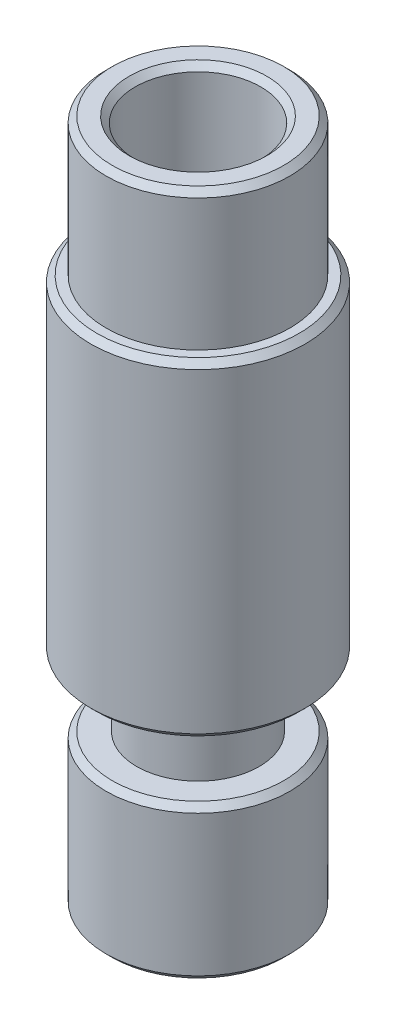
ISO-10303-21;
HEADER;
FILE_DESCRIPTION(('STEP AP214'),'2;1');
FILE_NAME('part.step','',(''),(''),'','','');
FILE_SCHEMA(('AUTOMOTIVE_DESIGN { 1 0 10303 214 1 1 1 1 }'));
ENDSEC;
DATA;
#1=APPLICATION_CONTEXT('core data for automotive mechanical design processes');
#2=APPLICATION_PROTOCOL_DEFINITION('international standard','automotive_design',2000,#1);
#3=PRODUCT_CONTEXT('',#1,'mechanical');
#4=PRODUCT('Part','Part','',(#3));
#5=PRODUCT_RELATED_PRODUCT_CATEGORY('part','',(#4));
#6=PRODUCT_DEFINITION_FORMATION('','',#4);
#7=PRODUCT_DEFINITION_CONTEXT('part definition',#1,'design');
#8=PRODUCT_DEFINITION('design','',#6,#7);
#9=PRODUCT_DEFINITION_SHAPE('','',#8);
#10=(LENGTH_UNIT() NAMED_UNIT(*) SI_UNIT(.MILLI.,.METRE.));
#11=(NAMED_UNIT(*) PLANE_ANGLE_UNIT() SI_UNIT($,.RADIAN.));
#12=(NAMED_UNIT(*) SI_UNIT($,.STERADIAN.) SOLID_ANGLE_UNIT());
#13=UNCERTAINTY_MEASURE_WITH_UNIT(LENGTH_MEASURE(1.E-05),#10,'distance_accuracy_value','');
#14=(GEOMETRIC_REPRESENTATION_CONTEXT(3) GLOBAL_UNCERTAINTY_ASSIGNED_CONTEXT((#13)) GLOBAL_UNIT_ASSIGNED_CONTEXT((#10,
#11,#12)) REPRESENTATION_CONTEXT('',''));
#15=CARTESIAN_POINT('',(0.,0.,0.));
#16=DIRECTION('',(0.,0.,1.));
#17=DIRECTION('',(1.,0.,0.));
#18=AXIS2_PLACEMENT_3D('',#15,#16,#17);
#19=CARTESIAN_POINT('',(0.,22.4,0.));
#20=DIRECTION('',(0.,1.,0.));
#21=DIRECTION('',(0.,0.,1.));
#22=AXIS2_PLACEMENT_3D('',#19,#20,#21);
#23=PLANE('',#22);
#24=CARTESIAN_POINT('',(0.,22.4,0.));
#25=DIRECTION('',(0.,1.,0.));
#26=DIRECTION('',(0.,0.,1.));
#27=AXIS2_PLACEMENT_3D('',#24,#25,#26);
#28=CIRCLE('',#27,2.8);
#29=CARTESIAN_POINT('',(0.,22.4,2.8));
#30=VERTEX_POINT('',#29);
#31=EDGE_CURVE('E47',#30,#30,#28,.T.);
#32=ORIENTED_EDGE('',*,*,#31,.T.);
#33=EDGE_LOOP('',(#32));
#34=FACE_BOUND('',#33,.T.);
#35=CARTESIAN_POINT('',(0.,22.4,0.));
#36=DIRECTION('',(0.,1.,0.));
#37=DIRECTION('',(0.,0.,1.));
#38=AXIS2_PLACEMENT_3D('',#35,#36,#37);
#39=CIRCLE('',#38,2.25);
#40=CARTESIAN_POINT('',(0.,22.4,2.25));
#41=VERTEX_POINT('',#40);
#42=EDGE_CURVE('E50',#41,#41,#39,.F.);
#43=ORIENTED_EDGE('',*,*,#42,.T.);
#44=EDGE_LOOP('',(#43));
#45=FACE_BOUND('',#44,.T.);
#46=ADVANCED_FACE('F15',(#34,#45),#23,.T.);
#47=CARTESIAN_POINT('',(0.,22.4,0.));
#48=DIRECTION('',(0.,-1.,0.));
#49=DIRECTION('',(0.,0.,-1.));
#50=AXIS2_PLACEMENT_3D('',#47,#48,#49);
#51=CYLINDRICAL_SURFACE('',#50,3.5);
#52=CARTESIAN_POINT('',(0.,7.4,0.));
#53=DIRECTION('',(0.,1.,0.));
#54=DIRECTION('',(0.,0.,1.));
#55=AXIS2_PLACEMENT_3D('',#52,#53,#54);
#56=CIRCLE('',#55,3.5);
#57=CARTESIAN_POINT('',(0.,7.4,3.5));
#58=VERTEX_POINT('',#57);
#59=EDGE_CURVE('E22',#58,#58,#56,.T.);
#60=ORIENTED_EDGE('',*,*,#59,.T.);
#61=EDGE_LOOP('',(#60));
#62=FACE_BOUND('',#61,.T.);
#63=CARTESIAN_POINT('',(0.,17.7,0.));
#64=DIRECTION('',(0.,1.,0.));
#65=DIRECTION('',(0.,0.,1.));
#66=AXIS2_PLACEMENT_3D('',#63,#64,#65);
#67=CIRCLE('',#66,3.5);
#68=CARTESIAN_POINT('',(0.,17.7,3.5));
#69=VERTEX_POINT('',#68);
#70=EDGE_CURVE('E53',#69,#69,#67,.F.);
#71=ORIENTED_EDGE('',*,*,#70,.T.);
#72=EDGE_LOOP('',(#71));
#73=FACE_BOUND('',#72,.T.);
#74=ADVANCED_FACE('F107',(#62,#73),#51,.T.);
#75=CARTESIAN_POINT('',(0.,22.4,0.));
#76=DIRECTION('',(0.,-1.,0.));
#77=DIRECTION('',(0.,0.,-1.));
#78=AXIS2_PLACEMENT_3D('',#75,#76,#77);
#79=CYLINDRICAL_SURFACE('',#78,1.);
#80=CARTESIAN_POINT('',(0.,16.4,0.));
#81=DIRECTION('',(0.,1.,0.));
#82=DIRECTION('',(0.,0.,1.));
#83=AXIS2_PLACEMENT_3D('',#80,#81,#82);
#84=CIRCLE('',#83,1.);
#85=CARTESIAN_POINT('',(0.,16.4,1.));
#86=VERTEX_POINT('',#85);
#87=EDGE_CURVE('E62',#86,#86,#84,.T.);
#88=ORIENTED_EDGE('',*,*,#87,.T.);
#89=EDGE_LOOP('',(#88));
#90=FACE_BOUND('',#89,.T.);
#91=CARTESIAN_POINT('',(0.,13.4,0.));
#92=DIRECTION('',(0.,1.,0.));
#93=DIRECTION('',(0.,0.,1.));
#94=AXIS2_PLACEMENT_3D('',#91,#92,#93);
#95=CIRCLE('',#94,1.);
#96=CARTESIAN_POINT('',(0.,13.4,1.));
#97=VERTEX_POINT('',#96);
#98=EDGE_CURVE('E65',#97,#97,#95,.T.);
#99=ORIENTED_EDGE('',*,*,#98,.F.);
#100=EDGE_LOOP('',(#99));
#101=FACE_BOUND('',#100,.T.);
#102=ADVANCED_FACE('F114',(#90,#101),#79,.F.);
#103=CARTESIAN_POINT('',(0.,0.,0.));
#104=DIRECTION('',(0.,1.,0.));
#105=DIRECTION('',(0.,0.,1.));
#106=AXIS2_PLACEMENT_3D('',#103,#104,#105);
#107=PLANE('',#106);
#108=CARTESIAN_POINT('',(0.,0.,0.));
#109=DIRECTION('',(0.,1.,0.));
#110=DIRECTION('',(0.,0.,1.));
#111=AXIS2_PLACEMENT_3D('',#108,#109,#110);
#112=CIRCLE('',#111,2.8);
#113=CARTESIAN_POINT('',(0.,0.,2.8));
#114=VERTEX_POINT('',#113);
#115=EDGE_CURVE('E30',#114,#114,#112,.F.);
#116=ORIENTED_EDGE('',*,*,#115,.T.);
#117=EDGE_LOOP('',(#116));
#118=FACE_BOUND('',#117,.T.);
#119=CARTESIAN_POINT('',(0.,0.,0.));
#120=DIRECTION('',(0.,1.,0.));
#121=DIRECTION('',(0.,0.,1.));
#122=AXIS2_PLACEMENT_3D('',#119,#120,#121);
#123=CIRCLE('',#122,1.6);
#124=CARTESIAN_POINT('',(0.,0.,1.6));
#125=VERTEX_POINT('',#124);
#126=EDGE_CURVE('E68',#125,#125,#123,.T.);
#127=ORIENTED_EDGE('',*,*,#126,.T.);
#128=EDGE_LOOP('',(#127));
#129=FACE_BOUND('',#128,.T.);
#130=ADVANCED_FACE('F120',(#118,#129),#107,.F.);
#131=CARTESIAN_POINT('',(0.,0.,0.));
#132=DIRECTION('',(0.,1.,0.));
#133=DIRECTION('',(0.,0.,1.));
#134=AXIS2_PLACEMENT_3D('',#131,#132,#133);
#135=CYLINDRICAL_SURFACE('',#134,1.6);
#136=ORIENTED_EDGE('',*,*,#126,.F.);
#137=EDGE_LOOP('',(#136));
#138=FACE_BOUND('',#137,.T.);
#139=CARTESIAN_POINT('',(0.,13.4,0.));
#140=DIRECTION('',(0.,1.,0.));
#141=DIRECTION('',(0.,0.,1.));
#142=AXIS2_PLACEMENT_3D('',#139,#140,#141);
#143=CIRCLE('',#142,1.6);
#144=CARTESIAN_POINT('',(0.,13.4,1.6));
#145=VERTEX_POINT('',#144);
#146=EDGE_CURVE('E69',#145,#145,#143,.T.);
#147=ORIENTED_EDGE('',*,*,#146,.T.);
#148=EDGE_LOOP('',(#147));
#149=FACE_BOUND('',#148,.T.);
#150=ADVANCED_FACE('F122',(#138,#149),#135,.F.);
#151=CARTESIAN_POINT('',(0.,13.4,0.));
#152=DIRECTION('',(0.,1.,0.));
#153=DIRECTION('',(0.,0.,1.));
#154=AXIS2_PLACEMENT_3D('',#151,#152,#153);
#155=PLANE('',#154);
#156=ORIENTED_EDGE('',*,*,#98,.T.);
#157=EDGE_LOOP('',(#156));
#158=FACE_BOUND('',#157,.T.);
#159=ORIENTED_EDGE('',*,*,#146,.F.);
#160=EDGE_LOOP('',(#159));
#161=FACE_BOUND('',#160,.T.);
#162=ADVANCED_FACE('F262',(#158,#161),#155,.F.);
#163=CARTESIAN_POINT('',(0.,17.4,0.));
#164=DIRECTION('',(0.,1.,0.));
#165=DIRECTION('',(0.,0.,1.));
#166=AXIS2_PLACEMENT_3D('',#163,#164,#165);
#167=CYLINDRICAL_SURFACE('',#166,2.05);
#168=CARTESIAN_POINT('',(0.,22.2,0.));
#169=DIRECTION('',(0.,1.,0.));
#170=DIRECTION('',(0.,0.,1.));
#171=AXIS2_PLACEMENT_3D('',#168,#169,#170);
#172=CIRCLE('',#171,2.05);
#173=CARTESIAN_POINT('',(0.,22.2,2.05));
#174=VERTEX_POINT('',#173);
#175=EDGE_CURVE('E41',#174,#174,#172,.T.);
#176=ORIENTED_EDGE('',*,*,#175,.T.);
#177=EDGE_LOOP('',(#176));
#178=FACE_BOUND('',#177,.T.);
#179=CARTESIAN_POINT('',(0.,17.4,0.));
#180=DIRECTION('',(0.,1.,0.));
#181=DIRECTION('',(0.,0.,1.));
#182=AXIS2_PLACEMENT_3D('',#179,#180,#181);
#183=CIRCLE('',#182,2.05);
#184=CARTESIAN_POINT('',(0.,17.4,2.05));
#185=VERTEX_POINT('',#184);
#186=EDGE_CURVE('E72',#185,#185,#183,.T.);
#187=ORIENTED_EDGE('',*,*,#186,.F.);
#188=EDGE_LOOP('',(#187));
#189=FACE_BOUND('',#188,.T.);
#190=ADVANCED_FACE('F252',(#178,#189),#167,.F.);
#191=CARTESIAN_POINT('',(0.,17.4,0.));
#192=DIRECTION('',(0.,1.,0.));
#193=DIRECTION('',(0.,0.,1.));
#194=AXIS2_PLACEMENT_3D('',#191,#192,#193);
#195=PLANE('',#194);
#196=CARTESIAN_POINT('',(0.,17.4,0.));
#197=DIRECTION('',(0.,1.,0.));
#198=DIRECTION('',(0.,0.,1.));
#199=AXIS2_PLACEMENT_3D('',#196,#197,#198);
#200=CIRCLE('',#199,2.);
#201=CARTESIAN_POINT('',(0.,17.4,2.));
#202=VERTEX_POINT('',#201);
#203=EDGE_CURVE('E59',#202,#202,#200,.F.);
#204=ORIENTED_EDGE('',*,*,#203,.T.);
#205=EDGE_LOOP('',(#204));
#206=FACE_BOUND('',#205,.T.);
#207=ORIENTED_EDGE('',*,*,#186,.T.);
#208=EDGE_LOOP('',(#207));
#209=FACE_BOUND('',#208,.T.);
#210=ADVANCED_FACE('F241',(#206,#209),#195,.T.);
#211=CARTESIAN_POINT('',(0.,17.9,0.));
#212=DIRECTION('',(0.,1.,0.));
#213=DIRECTION('',(0.,0.,1.));
#214=AXIS2_PLACEMENT_3D('',#211,#212,#213);
#215=PLANE('',#214);
#216=CARTESIAN_POINT('',(0.,17.9,0.));
#217=DIRECTION('',(0.,1.,0.));
#218=DIRECTION('',(0.,0.,1.));
#219=AXIS2_PLACEMENT_3D('',#216,#217,#218);
#220=CIRCLE('',#219,3.3);
#221=CARTESIAN_POINT('',(0.,17.9,3.3));
#222=VERTEX_POINT('',#221);
#223=EDGE_CURVE('E56',#222,#222,#220,.T.);
#224=ORIENTED_EDGE('',*,*,#223,.T.);
#225=EDGE_LOOP('',(#224));
#226=FACE_BOUND('',#225,.T.);
#227=CARTESIAN_POINT('',(0.,17.9,0.));
#228=DIRECTION('',(0.,1.,0.));
#229=DIRECTION('',(0.,0.,1.));
#230=AXIS2_PLACEMENT_3D('',#227,#228,#229);
#231=CIRCLE('',#230,3.);
#232=CARTESIAN_POINT('',(0.,17.9,3.));
#233=VERTEX_POINT('',#232);
#234=EDGE_CURVE('E77',#233,#233,#231,.T.);
#235=ORIENTED_EDGE('',*,*,#234,.F.);
#236=EDGE_LOOP('',(#235));
#237=FACE_BOUND('',#236,.T.);
#238=ADVANCED_FACE('F231',(#226,#237),#215,.T.);
#239=CARTESIAN_POINT('',(0.,17.9,0.));
#240=DIRECTION('',(0.,1.,0.));
#241=DIRECTION('',(0.,0.,1.));
#242=AXIS2_PLACEMENT_3D('',#239,#240,#241);
#243=CYLINDRICAL_SURFACE('',#242,3.);
#244=CARTESIAN_POINT('',(0.,22.2,0.));
#245=DIRECTION('',(0.,1.,0.));
#246=DIRECTION('',(0.,0.,1.));
#247=AXIS2_PLACEMENT_3D('',#244,#245,#246);
#248=CIRCLE('',#247,3.);
#249=CARTESIAN_POINT('',(0.,22.2,3.));
#250=VERTEX_POINT('',#249);
#251=EDGE_CURVE('E44',#250,#250,#248,.F.);
#252=ORIENTED_EDGE('',*,*,#251,.T.);
#253=EDGE_LOOP('',(#252));
#254=FACE_BOUND('',#253,.T.);
#255=ORIENTED_EDGE('',*,*,#234,.T.);
#256=EDGE_LOOP('',(#255));
#257=FACE_BOUND('',#256,.T.);
#258=ADVANCED_FACE('F129',(#254,#257),#243,.T.);
#259=CARTESIAN_POINT('',(0.,16.4,0.));
#260=DIRECTION('',(0.,1.,0.));
#261=DIRECTION('',(0.,0.,1.));
#262=AXIS2_PLACEMENT_3D('',#259,#260,#261);
#263=CONICAL_SURFACE('',#262,1.,0.785398163397449);
#264=ORIENTED_EDGE('',*,*,#203,.F.);
#265=EDGE_LOOP('',(#264));
#266=FACE_BOUND('',#265,.T.);
#267=ORIENTED_EDGE('',*,*,#87,.F.);
#268=EDGE_LOOP('',(#267));
#269=FACE_BOUND('',#268,.T.);
#270=ADVANCED_FACE('F125',(#266,#269),#263,.F.);
#271=CARTESIAN_POINT('',(0.,17.9,0.));
#272=DIRECTION('',(0.,-1.,0.));
#273=DIRECTION('',(0.,0.,-1.));
#274=AXIS2_PLACEMENT_3D('',#271,#272,#273);
#275=CONICAL_SURFACE('',#274,3.3,0.785398163397449);
#276=ORIENTED_EDGE('',*,*,#70,.F.);
#277=EDGE_LOOP('',(#276));
#278=FACE_BOUND('',#277,.T.);
#279=ORIENTED_EDGE('',*,*,#223,.F.);
#280=EDGE_LOOP('',(#279));
#281=FACE_BOUND('',#280,.T.);
#282=ADVANCED_FACE('F128',(#278,#281),#275,.T.);
#283=CARTESIAN_POINT('',(0.,22.4,0.));
#284=DIRECTION('',(0.,-1.,0.));
#285=DIRECTION('',(0.,0.,-1.));
#286=AXIS2_PLACEMENT_3D('',#283,#284,#285);
#287=CONICAL_SURFACE('',#286,2.8,0.785398163397444);
#288=ORIENTED_EDGE('',*,*,#251,.F.);
#289=EDGE_LOOP('',(#288));
#290=FACE_BOUND('',#289,.T.);
#291=ORIENTED_EDGE('',*,*,#31,.F.);
#292=EDGE_LOOP('',(#291));
#293=FACE_BOUND('',#292,.T.);
#294=ADVANCED_FACE('F133',(#290,#293),#287,.T.);
#295=CARTESIAN_POINT('',(0.,22.2,0.));
#296=DIRECTION('',(0.,1.,0.));
#297=DIRECTION('',(0.,0.,1.));
#298=AXIS2_PLACEMENT_3D('',#295,#296,#297);
#299=CONICAL_SURFACE('',#298,2.05,0.785398163397448);
#300=ORIENTED_EDGE('',*,*,#42,.F.);
#301=EDGE_LOOP('',(#300));
#302=FACE_BOUND('',#301,.T.);
#303=ORIENTED_EDGE('',*,*,#175,.F.);
#304=EDGE_LOOP('',(#303));
#305=FACE_BOUND('',#304,.T.);
#306=ADVANCED_FACE('F137',(#302,#305),#299,.F.);
#307=CARTESIAN_POINT('',(-3.5,7.2,0.));
#308=DIRECTION('',(0.,1.,0.));
#309=DIRECTION('',(0.,0.,1.));
#310=AXIS2_PLACEMENT_3D('',#307,#308,#309);
#311=PLANE('',#310);
#312=CARTESIAN_POINT('',(0.,7.2,0.));
#313=DIRECTION('',(0.,1.,0.));
#314=DIRECTION('',(0.,0.,1.));
#315=AXIS2_PLACEMENT_3D('',#312,#313,#314);
#316=CIRCLE('',#315,3.3);
#317=CARTESIAN_POINT('',(0.,7.2,3.3));
#318=VERTEX_POINT('',#317);
#319=EDGE_CURVE('E10',#318,#318,#316,.F.);
#320=ORIENTED_EDGE('',*,*,#319,.T.);
#321=EDGE_LOOP('',(#320));
#322=FACE_BOUND('',#321,.T.);
#323=CARTESIAN_POINT('',(0.,7.2,0.));
#324=DIRECTION('',(0.,1.,0.));
#325=DIRECTION('',(0.,0.,1.));
#326=AXIS2_PLACEMENT_3D('',#323,#324,#325);
#327=CIRCLE('',#326,2.);
#328=CARTESIAN_POINT('',(0.,7.2,2.));
#329=VERTEX_POINT('',#328);
#330=EDGE_CURVE('E80',#329,#329,#327,.T.);
#331=ORIENTED_EDGE('',*,*,#330,.T.);
#332=EDGE_LOOP('',(#331));
#333=FACE_BOUND('',#332,.T.);
#334=ADVANCED_FACE('F103',(#322,#333),#311,.F.);
#335=CARTESIAN_POINT('',(0.,16.6967247110871,0.));
#336=DIRECTION('',(0.,1.,0.));
#337=DIRECTION('',(0.,0.,1.));
#338=AXIS2_PLACEMENT_3D('',#335,#336,#337);
#339=CYLINDRICAL_SURFACE('',#338,2.);
#340=ORIENTED_EDGE('',*,*,#330,.F.);
#341=EDGE_LOOP('',(#340));
#342=FACE_BOUND('',#341,.T.);
#343=CARTESIAN_POINT('',(0.,5.,0.));
#344=DIRECTION('',(0.,1.,0.));
#345=DIRECTION('',(0.,0.,1.));
#346=AXIS2_PLACEMENT_3D('',#343,#344,#345);
#347=CIRCLE('',#346,2.);
#348=CARTESIAN_POINT('',(0.,5.,2.));
#349=VERTEX_POINT('',#348);
#350=EDGE_CURVE('E83',#349,#349,#347,.T.);
#351=ORIENTED_EDGE('',*,*,#350,.T.);
#352=EDGE_LOOP('',(#351));
#353=FACE_BOUND('',#352,.T.);
#354=ADVANCED_FACE('F87',(#342,#353),#339,.T.);
#355=CARTESIAN_POINT('',(-3.,5.,0.));
#356=DIRECTION('',(0.,-1.,0.));
#357=DIRECTION('',(0.,0.,-1.));
#358=AXIS2_PLACEMENT_3D('',#355,#356,#357);
#359=PLANE('',#358);
#360=CARTESIAN_POINT('',(0.,5.,0.));
#361=DIRECTION('',(0.,-1.,0.));
#362=DIRECTION('',(0.,0.,-1.));
#363=AXIS2_PLACEMENT_3D('',#360,#361,#362);
#364=CIRCLE('',#363,2.8);
#365=CARTESIAN_POINT('',(0.,5.,-2.8));
#366=VERTEX_POINT('',#365);
#367=EDGE_CURVE('E26',#366,#366,#364,.F.);
#368=ORIENTED_EDGE('',*,*,#367,.T.);
#369=EDGE_LOOP('',(#368));
#370=FACE_BOUND('',#369,.T.);
#371=ORIENTED_EDGE('',*,*,#350,.F.);
#372=EDGE_LOOP('',(#371));
#373=FACE_BOUND('',#372,.T.);
#374=ADVANCED_FACE('F89',(#370,#373),#359,.F.);
#375=CARTESIAN_POINT('',(0.,16.6967247110871,0.));
#376=DIRECTION('',(0.,1.,0.));
#377=DIRECTION('',(0.,0.,1.));
#378=AXIS2_PLACEMENT_3D('',#375,#376,#377);
#379=CYLINDRICAL_SURFACE('',#378,3.);
#380=CARTESIAN_POINT('',(0.,0.200000000000003,0.));
#381=DIRECTION('',(0.,1.,0.));
#382=DIRECTION('',(0.,0.,1.));
#383=AXIS2_PLACEMENT_3D('',#380,#381,#382);
#384=CIRCLE('',#383,3.);
#385=CARTESIAN_POINT('',(0.,0.200000000000003,3.));
#386=VERTEX_POINT('',#385);
#387=EDGE_CURVE('E35',#386,#386,#384,.T.);
#388=ORIENTED_EDGE('',*,*,#387,.T.);
#389=EDGE_LOOP('',(#388));
#390=FACE_BOUND('',#389,.T.);
#391=CARTESIAN_POINT('',(0.,4.8,0.));
#392=DIRECTION('',(0.,-1.,0.));
#393=DIRECTION('',(0.,0.,-1.));
#394=AXIS2_PLACEMENT_3D('',#391,#392,#393);
#395=CIRCLE('',#394,3.);
#396=CARTESIAN_POINT('',(0.,4.8,-3.));
#397=VERTEX_POINT('',#396);
#398=EDGE_CURVE('E38',#397,#397,#395,.T.);
#399=ORIENTED_EDGE('',*,*,#398,.T.);
#400=EDGE_LOOP('',(#399));
#401=FACE_BOUND('',#400,.T.);
#402=ADVANCED_FACE('F91',(#390,#401),#379,.T.);
#403=CARTESIAN_POINT('',(0.,0.200000000000003,0.));
#404=DIRECTION('',(0.,1.,0.));
#405=DIRECTION('',(0.,0.,1.));
#406=AXIS2_PLACEMENT_3D('',#403,#404,#405);
#407=CONICAL_SURFACE('',#406,3.,0.78539816339745);
#408=ORIENTED_EDGE('',*,*,#115,.F.);
#409=EDGE_LOOP('',(#408));
#410=FACE_BOUND('',#409,.T.);
#411=ORIENTED_EDGE('',*,*,#387,.F.);
#412=EDGE_LOOP('',(#411));
#413=FACE_BOUND('',#412,.T.);
#414=ADVANCED_FACE('F100',(#410,#413),#407,.T.);
#415=CARTESIAN_POINT('',(0.,5.,0.));
#416=DIRECTION('',(0.,-1.,0.));
#417=DIRECTION('',(0.,0.,-1.));
#418=AXIS2_PLACEMENT_3D('',#415,#416,#417);
#419=CONICAL_SURFACE('',#418,2.8,0.785398163397442);
#420=ORIENTED_EDGE('',*,*,#398,.F.);
#421=EDGE_LOOP('',(#420));
#422=FACE_BOUND('',#421,.T.);
#423=ORIENTED_EDGE('',*,*,#367,.F.);
#424=EDGE_LOOP('',(#423));
#425=FACE_BOUND('',#424,.T.);
#426=ADVANCED_FACE('F143',(#422,#425),#419,.T.);
#427=CARTESIAN_POINT('',(0.,7.4,0.));
#428=DIRECTION('',(0.,1.,0.));
#429=DIRECTION('',(0.,0.,1.));
#430=AXIS2_PLACEMENT_3D('',#427,#428,#429);
#431=CONICAL_SURFACE('',#430,3.5,0.785398163397445);
#432=ORIENTED_EDGE('',*,*,#319,.F.);
#433=EDGE_LOOP('',(#432));
#434=FACE_BOUND('',#433,.T.);
#435=ORIENTED_EDGE('',*,*,#59,.F.);
#436=EDGE_LOOP('',(#435));
#437=FACE_BOUND('',#436,.T.);
#438=ADVANCED_FACE('F17',(#434,#437),#431,.T.);
#439=CLOSED_SHELL('',(#46,#74,#102,#130,#150,#162,#190,#210,#238,#258,#270,#282,#294,#306,#334,
#354,#374,#402,#414,#426,#438));
#440=MANIFOLD_SOLID_BREP('B1',#439);
#441=ADVANCED_BREP_SHAPE_REPRESENTATION('',(#18,#440),#14);
#442=SHAPE_DEFINITION_REPRESENTATION(#9,#441);
ENDSEC;
END-ISO-10303-21;
